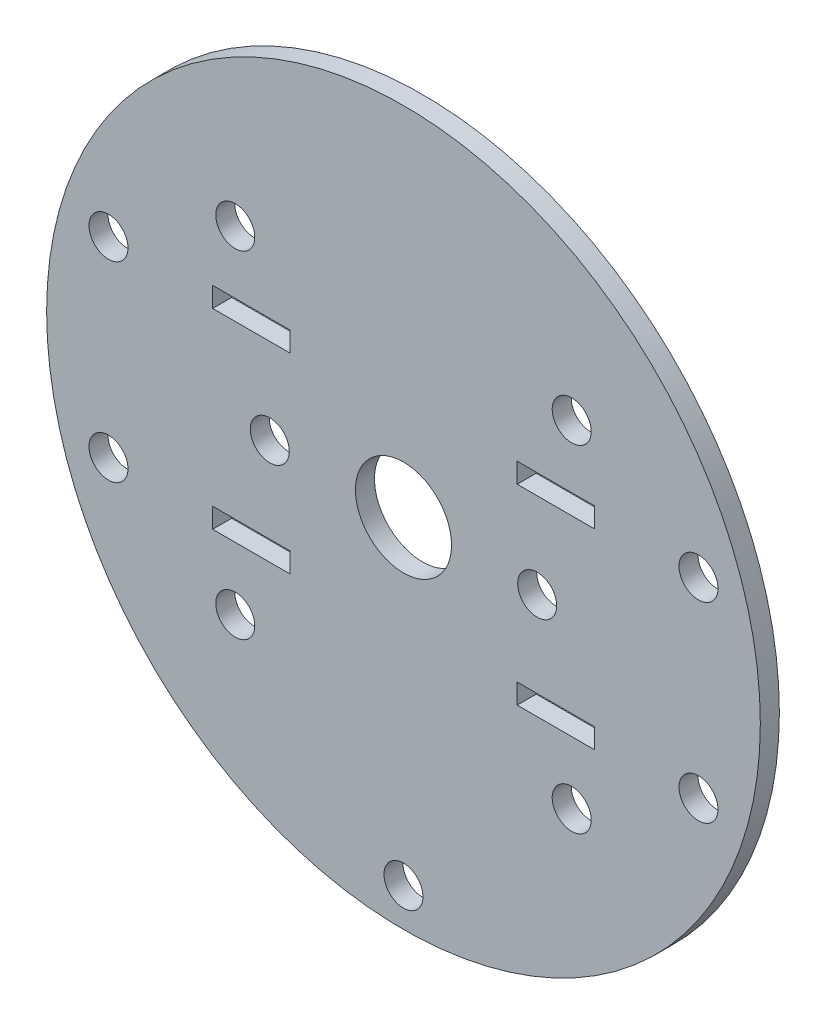
ISO-10303-21;
HEADER;
FILE_DESCRIPTION(('STEP AP214'),'2;1');
FILE_NAME('part.step','',(''),(''),'','','');
FILE_SCHEMA(('AUTOMOTIVE_DESIGN { 1 0 10303 214 1 1 1 1 }'));
ENDSEC;
DATA;
#1=APPLICATION_CONTEXT('core data for automotive mechanical design processes');
#2=APPLICATION_PROTOCOL_DEFINITION('international standard','automotive_design',2000,#1);
#3=PRODUCT_CONTEXT('',#1,'mechanical');
#4=PRODUCT('Part','Part','',(#3));
#5=PRODUCT_RELATED_PRODUCT_CATEGORY('part','',(#4));
#6=PRODUCT_DEFINITION_FORMATION('','',#4);
#7=PRODUCT_DEFINITION_CONTEXT('part definition',#1,'design');
#8=PRODUCT_DEFINITION('design','',#6,#7);
#9=PRODUCT_DEFINITION_SHAPE('','',#8);
#10=(LENGTH_UNIT() NAMED_UNIT(*) SI_UNIT(.MILLI.,.METRE.));
#11=(NAMED_UNIT(*) PLANE_ANGLE_UNIT() SI_UNIT($,.RADIAN.));
#12=(NAMED_UNIT(*) SI_UNIT($,.STERADIAN.) SOLID_ANGLE_UNIT());
#13=UNCERTAINTY_MEASURE_WITH_UNIT(LENGTH_MEASURE(1.E-05),#10,'distance_accuracy_value','');
#14=(GEOMETRIC_REPRESENTATION_CONTEXT(3) GLOBAL_UNCERTAINTY_ASSIGNED_CONTEXT((#13)) GLOBAL_UNIT_ASSIGNED_CONTEXT((#10,
#11,#12)) REPRESENTATION_CONTEXT('',''));
#15=CARTESIAN_POINT('',(0.,0.,0.));
#16=DIRECTION('',(0.,0.,1.));
#17=DIRECTION('',(1.,0.,0.));
#18=AXIS2_PLACEMENT_3D('',#15,#16,#17);
#19=CARTESIAN_POINT('',(0.,0.,2.));
#20=DIRECTION('',(0.,0.,1.));
#21=DIRECTION('',(1.,0.,0.));
#22=AXIS2_PLACEMENT_3D('',#19,#20,#21);
#23=PLANE('',#22);
#24=CARTESIAN_POINT('',(-14.05,0.,2.));
#25=DIRECTION('',(0.,0.,1.));
#26=DIRECTION('',(1.,0.,0.));
#27=AXIS2_PLACEMENT_3D('',#24,#25,#26);
#28=CIRCLE('',#27,2.05);
#29=CARTESIAN_POINT('',(-12.,0.,2.));
#30=VERTEX_POINT('',#29);
#31=EDGE_CURVE('E336',#30,#30,#28,.T.);
#32=ORIENTED_EDGE('',*,*,#31,.F.);
#33=EDGE_LOOP('',(#32));
#34=FACE_BOUND('',#33,.T.);
#35=CARTESIAN_POINT('',(31.,-10.05,2.));
#36=DIRECTION('',(0.,0.,1.));
#37=DIRECTION('',(-1.,0.,0.));
#38=AXIS2_PLACEMENT_3D('',#35,#36,#37);
#39=CIRCLE('',#38,2.05);
#40=CARTESIAN_POINT('',(28.95,-10.05,2.));
#41=VERTEX_POINT('',#40);
#42=EDGE_CURVE('E340',#41,#41,#39,.T.);
#43=ORIENTED_EDGE('',*,*,#42,.F.);
#44=EDGE_LOOP('',(#43));
#45=FACE_BOUND('',#44,.T.);
#46=CARTESIAN_POINT('',(-31.,10.05,2.));
#47=DIRECTION('',(0.,0.,1.));
#48=DIRECTION('',(-1.,0.,0.));
#49=AXIS2_PLACEMENT_3D('',#46,#47,#48);
#50=CIRCLE('',#49,2.05);
#51=CARTESIAN_POINT('',(-33.05,10.05,2.));
#52=VERTEX_POINT('',#51);
#53=EDGE_CURVE('E343',#52,#52,#50,.T.);
#54=ORIENTED_EDGE('',*,*,#53,.F.);
#55=EDGE_LOOP('',(#54));
#56=FACE_BOUND('',#55,.T.);
#57=DIRECTION('',(0.,1.,0.));
#58=VECTOR('',#57,1.);
#59=CARTESIAN_POINT('',(-11.95,-11.1,2.));
#60=LINE('',#59,#58);
#61=CARTESIAN_POINT('',(-11.95,-11.1,2.));
#62=VERTEX_POINT('',#61);
#63=CARTESIAN_POINT('',(-11.95,-8.99999999999999,2.));
#64=VERTEX_POINT('',#63);
#65=EDGE_CURVE('E156',#62,#64,#60,.T.);
#66=ORIENTED_EDGE('',*,*,#65,.F.);
#67=DIRECTION('',(1.,0.,0.));
#68=VECTOR('',#67,1.);
#69=CARTESIAN_POINT('',(-11.95,-11.1,2.));
#70=LINE('',#69,#68);
#71=CARTESIAN_POINT('',(-20.05,-11.1,2.));
#72=VERTEX_POINT('',#71);
#73=EDGE_CURVE('E148',#72,#62,#70,.T.);
#74=ORIENTED_EDGE('',*,*,#73,.F.);
#75=DIRECTION('',(0.,-1.,0.));
#76=VECTOR('',#75,1.);
#77=CARTESIAN_POINT('',(-20.05,-11.1,2.));
#78=LINE('',#77,#76);
#79=CARTESIAN_POINT('',(-20.05,-8.99999999999999,2.));
#80=VERTEX_POINT('',#79);
#81=EDGE_CURVE('E171',#80,#72,#78,.T.);
#82=ORIENTED_EDGE('',*,*,#81,.F.);
#83=DIRECTION('',(-1.,0.,0.));
#84=VECTOR('',#83,1.);
#85=CARTESIAN_POINT('',(-11.95,-8.99999999999999,2.));
#86=LINE('',#85,#84);
#87=EDGE_CURVE('E169',#64,#80,#86,.T.);
#88=ORIENTED_EDGE('',*,*,#87,.F.);
#89=EDGE_LOOP('',(#66,#74,#82,#88));
#90=FACE_BOUND('',#89,.T.);
#91=DIRECTION('',(0.,-1.,0.));
#92=VECTOR('',#91,1.);
#93=CARTESIAN_POINT('',(-20.05,11.1,2.));
#94=LINE('',#93,#92);
#95=CARTESIAN_POINT('',(-20.05,11.1,2.));
#96=VERTEX_POINT('',#95);
#97=CARTESIAN_POINT('',(-20.05,8.99999999999999,2.));
#98=VERTEX_POINT('',#97);
#99=EDGE_CURVE('E189',#96,#98,#94,.T.);
#100=ORIENTED_EDGE('',*,*,#99,.F.);
#101=DIRECTION('',(-1.,0.,0.));
#102=VECTOR('',#101,1.);
#103=CARTESIAN_POINT('',(-11.95,11.1,2.));
#104=LINE('',#103,#102);
#105=CARTESIAN_POINT('',(-11.95,11.1,2.));
#106=VERTEX_POINT('',#105);
#107=EDGE_CURVE('E187',#106,#96,#104,.T.);
#108=ORIENTED_EDGE('',*,*,#107,.F.);
#109=DIRECTION('',(0.,1.,0.));
#110=VECTOR('',#109,1.);
#111=CARTESIAN_POINT('',(-11.95,11.1,2.));
#112=LINE('',#111,#110);
#113=CARTESIAN_POINT('',(-11.95,8.99999999999999,2.));
#114=VERTEX_POINT('',#113);
#115=EDGE_CURVE('E195',#114,#106,#112,.T.);
#116=ORIENTED_EDGE('',*,*,#115,.F.);
#117=DIRECTION('',(1.,0.,0.));
#118=VECTOR('',#117,1.);
#119=CARTESIAN_POINT('',(-11.95,8.99999999999999,2.));
#120=LINE('',#119,#118);
#121=EDGE_CURVE('E192',#98,#114,#120,.T.);
#122=ORIENTED_EDGE('',*,*,#121,.F.);
#123=EDGE_LOOP('',(#100,#108,#116,#122));
#124=FACE_BOUND('',#123,.T.);
#125=CARTESIAN_POINT('',(17.6776695296637,-17.6776695296637,2.));
#126=DIRECTION('',(0.,0.,1.));
#127=DIRECTION('',(1.,0.,0.));
#128=AXIS2_PLACEMENT_3D('',#125,#126,#127);
#129=CIRCLE('',#128,2.05);
#130=CARTESIAN_POINT('',(19.7276695296637,-17.6776695296637,2.));
#131=VERTEX_POINT('',#130);
#132=EDGE_CURVE('E218',#131,#131,#129,.T.);
#133=ORIENTED_EDGE('',*,*,#132,.F.);
#134=EDGE_LOOP('',(#133));
#135=FACE_BOUND('',#134,.T.);
#136=CARTESIAN_POINT('',(-17.6776695296637,17.6776695296637,2.));
#137=DIRECTION('',(0.,0.,1.));
#138=DIRECTION('',(1.,0.,0.));
#139=AXIS2_PLACEMENT_3D('',#136,#137,#138);
#140=CIRCLE('',#139,2.05);
#141=CARTESIAN_POINT('',(-15.6276695296637,17.6776695296637,2.));
#142=VERTEX_POINT('',#141);
#143=EDGE_CURVE('E230',#142,#142,#140,.T.);
#144=ORIENTED_EDGE('',*,*,#143,.F.);
#145=EDGE_LOOP('',(#144));
#146=FACE_BOUND('',#145,.T.);
#147=CARTESIAN_POINT('',(0.,0.,2.));
#148=DIRECTION('',(0.,0.,1.));
#149=DIRECTION('',(1.,0.,0.));
#150=AXIS2_PLACEMENT_3D('',#147,#148,#149);
#151=CIRCLE('',#150,5.05);
#152=CARTESIAN_POINT('',(5.05,0.,2.));
#153=VERTEX_POINT('',#152);
#154=EDGE_CURVE('E304',#153,#153,#151,.T.);
#155=ORIENTED_EDGE('',*,*,#154,.F.);
#156=EDGE_LOOP('',(#155));
#157=FACE_BOUND('',#156,.T.);
#158=CARTESIAN_POINT('',(0.,0.,2.));
#159=DIRECTION('',(0.,0.,1.));
#160=DIRECTION('',(1.,0.,0.));
#161=AXIS2_PLACEMENT_3D('',#158,#159,#160);
#162=CIRCLE('',#161,37.5);
#163=CARTESIAN_POINT('',(37.5,0.,2.));
#164=VERTEX_POINT('',#163);
#165=EDGE_CURVE('E11',#164,#164,#162,.T.);
#166=ORIENTED_EDGE('',*,*,#165,.T.);
#167=EDGE_LOOP('',(#166));
#168=FACE_BOUND('',#167,.T.);
#169=CARTESIAN_POINT('',(-17.6776695296637,-17.6776695296637,2.));
#170=DIRECTION('',(0.,0.,1.));
#171=DIRECTION('',(1.,0.,0.));
#172=AXIS2_PLACEMENT_3D('',#169,#170,#171);
#173=CIRCLE('',#172,2.05);
#174=CARTESIAN_POINT('',(-15.6276695296637,-17.6776695296637,2.));
#175=VERTEX_POINT('',#174);
#176=EDGE_CURVE('E298',#175,#175,#173,.T.);
#177=ORIENTED_EDGE('',*,*,#176,.F.);
#178=EDGE_LOOP('',(#177));
#179=FACE_BOUND('',#178,.T.);
#180=DIRECTION('',(0.,1.,0.));
#181=VECTOR('',#180,1.);
#182=CARTESIAN_POINT('',(20.05,-11.1,2.));
#183=LINE('',#182,#181);
#184=CARTESIAN_POINT('',(20.05,-11.1,2.));
#185=VERTEX_POINT('',#184);
#186=CARTESIAN_POINT('',(20.05,-9.,2.));
#187=VERTEX_POINT('',#186);
#188=EDGE_CURVE('E269',#185,#187,#183,.T.);
#189=ORIENTED_EDGE('',*,*,#188,.F.);
#190=DIRECTION('',(1.,0.,0.));
#191=VECTOR('',#190,1.);
#192=CARTESIAN_POINT('',(11.95,-11.1,2.));
#193=LINE('',#192,#191);
#194=CARTESIAN_POINT('',(11.95,-11.1,2.));
#195=VERTEX_POINT('',#194);
#196=EDGE_CURVE('E267',#195,#185,#193,.T.);
#197=ORIENTED_EDGE('',*,*,#196,.F.);
#198=DIRECTION('',(0.,-1.,0.));
#199=VECTOR('',#198,1.);
#200=CARTESIAN_POINT('',(11.95,-11.1,2.));
#201=LINE('',#200,#199);
#202=CARTESIAN_POINT('',(11.95,-9.,2.));
#203=VERTEX_POINT('',#202);
#204=EDGE_CURVE('E275',#203,#195,#201,.T.);
#205=ORIENTED_EDGE('',*,*,#204,.F.);
#206=DIRECTION('',(-1.,0.,0.));
#207=VECTOR('',#206,1.);
#208=CARTESIAN_POINT('',(11.95,-9.,2.));
#209=LINE('',#208,#207);
#210=EDGE_CURVE('E272',#187,#203,#209,.T.);
#211=ORIENTED_EDGE('',*,*,#210,.F.);
#212=EDGE_LOOP('',(#189,#197,#205,#211));
#213=FACE_BOUND('',#212,.T.);
#214=DIRECTION('',(0.,-1.,0.));
#215=VECTOR('',#214,1.);
#216=CARTESIAN_POINT('',(11.95,11.1,2.));
#217=LINE('',#216,#215);
#218=CARTESIAN_POINT('',(11.95,11.1,2.));
#219=VERTEX_POINT('',#218);
#220=CARTESIAN_POINT('',(11.95,9.,2.));
#221=VERTEX_POINT('',#220);
#222=EDGE_CURVE('E238',#219,#221,#217,.T.);
#223=ORIENTED_EDGE('',*,*,#222,.F.);
#224=DIRECTION('',(-1.,0.,0.));
#225=VECTOR('',#224,1.);
#226=CARTESIAN_POINT('',(11.95,11.1,2.));
#227=LINE('',#226,#225);
#228=CARTESIAN_POINT('',(20.05,11.1,2.));
#229=VERTEX_POINT('',#228);
#230=EDGE_CURVE('E236',#229,#219,#227,.T.);
#231=ORIENTED_EDGE('',*,*,#230,.F.);
#232=DIRECTION('',(0.,1.,0.));
#233=VECTOR('',#232,1.);
#234=CARTESIAN_POINT('',(20.05,11.1,2.));
#235=LINE('',#234,#233);
#236=CARTESIAN_POINT('',(20.05,9.,2.));
#237=VERTEX_POINT('',#236);
#238=EDGE_CURVE('E244',#237,#229,#235,.T.);
#239=ORIENTED_EDGE('',*,*,#238,.F.);
#240=DIRECTION('',(1.,0.,0.));
#241=VECTOR('',#240,1.);
#242=CARTESIAN_POINT('',(11.95,9.,2.));
#243=LINE('',#242,#241);
#244=EDGE_CURVE('E241',#221,#237,#243,.T.);
#245=ORIENTED_EDGE('',*,*,#244,.F.);
#246=EDGE_LOOP('',(#223,#231,#239,#245));
#247=FACE_BOUND('',#246,.T.);
#248=CARTESIAN_POINT('',(17.6776695296637,17.6776695296637,2.));
#249=DIRECTION('',(0.,0.,1.));
#250=DIRECTION('',(1.,0.,0.));
#251=AXIS2_PLACEMENT_3D('',#248,#249,#250);
#252=CIRCLE('',#251,2.05);
#253=CARTESIAN_POINT('',(19.7276695296637,17.6776695296637,2.));
#254=VERTEX_POINT('',#253);
#255=EDGE_CURVE('E224',#254,#254,#252,.T.);
#256=ORIENTED_EDGE('',*,*,#255,.F.);
#257=EDGE_LOOP('',(#256));
#258=FACE_BOUND('',#257,.T.);
#259=CARTESIAN_POINT('',(-31.,-10.05,2.));
#260=DIRECTION('',(0.,0.,1.));
#261=DIRECTION('',(1.,0.,0.));
#262=AXIS2_PLACEMENT_3D('',#259,#260,#261);
#263=CIRCLE('',#262,2.05);
#264=CARTESIAN_POINT('',(-28.95,-10.05,2.));
#265=VERTEX_POINT('',#264);
#266=EDGE_CURVE('E177',#265,#265,#263,.T.);
#267=ORIENTED_EDGE('',*,*,#266,.F.);
#268=EDGE_LOOP('',(#267));
#269=FACE_BOUND('',#268,.T.);
#270=CARTESIAN_POINT('',(31.,10.05,2.));
#271=DIRECTION('',(0.,0.,1.));
#272=DIRECTION('',(1.,0.,0.));
#273=AXIS2_PLACEMENT_3D('',#270,#271,#272);
#274=CIRCLE('',#273,2.05);
#275=CARTESIAN_POINT('',(33.05,10.05,2.));
#276=VERTEX_POINT('',#275);
#277=EDGE_CURVE('E350',#276,#276,#274,.T.);
#278=ORIENTED_EDGE('',*,*,#277,.F.);
#279=EDGE_LOOP('',(#278));
#280=FACE_BOUND('',#279,.T.);
#281=CARTESIAN_POINT('',(14.05,0.,2.));
#282=DIRECTION('',(0.,0.,1.));
#283=DIRECTION('',(1.,0.,0.));
#284=AXIS2_PLACEMENT_3D('',#281,#282,#283);
#285=CIRCLE('',#284,2.05);
#286=CARTESIAN_POINT('',(16.1,0.,2.));
#287=VERTEX_POINT('',#286);
#288=EDGE_CURVE('E369',#287,#287,#285,.T.);
#289=ORIENTED_EDGE('',*,*,#288,.F.);
#290=EDGE_LOOP('',(#289));
#291=FACE_BOUND('',#290,.T.);
#292=CARTESIAN_POINT('',(0.,-33.5,2.));
#293=DIRECTION('',(0.,0.,1.));
#294=DIRECTION('',(1.,0.,0.));
#295=AXIS2_PLACEMENT_3D('',#292,#293,#294);
#296=CIRCLE('',#295,2.05);
#297=CARTESIAN_POINT('',(2.05000000000001,-33.5,2.));
#298=VERTEX_POINT('',#297);
#299=EDGE_CURVE('E372',#298,#298,#296,.T.);
#300=ORIENTED_EDGE('',*,*,#299,.F.);
#301=EDGE_LOOP('',(#300));
#302=FACE_BOUND('',#301,.T.);
#303=ADVANCED_FACE('F35',(#34,#45,#56,#90,#124,#135,#146,#157,#168,#179,#213,#247,#258,#269,
#280,#291,#302),#23,.T.);
#304=CARTESIAN_POINT('',(0.,0.,0.));
#305=DIRECTION('',(0.,0.,1.));
#306=DIRECTION('',(1.,0.,0.));
#307=AXIS2_PLACEMENT_3D('',#304,#305,#306);
#308=PLANE('',#307);
#309=DIRECTION('',(-1.,0.,0.));
#310=VECTOR('',#309,1.);
#311=CARTESIAN_POINT('',(-11.95,11.1,0.));
#312=LINE('',#311,#310);
#313=CARTESIAN_POINT('',(-11.95,11.1,0.));
#314=VERTEX_POINT('',#313);
#315=CARTESIAN_POINT('',(-20.05,11.1,0.));
#316=VERTEX_POINT('',#315);
#317=EDGE_CURVE('E164',#314,#316,#312,.T.);
#318=ORIENTED_EDGE('',*,*,#317,.T.);
#319=DIRECTION('',(0.,-1.,0.));
#320=VECTOR('',#319,1.);
#321=CARTESIAN_POINT('',(-20.05,11.1,0.));
#322=LINE('',#321,#320);
#323=CARTESIAN_POINT('',(-20.05,8.99999999999999,0.));
#324=VERTEX_POINT('',#323);
#325=EDGE_CURVE('E200',#316,#324,#322,.T.);
#326=ORIENTED_EDGE('',*,*,#325,.T.);
#327=DIRECTION('',(1.,0.,0.));
#328=VECTOR('',#327,1.);
#329=CARTESIAN_POINT('',(-11.95,8.99999999999999,0.));
#330=LINE('',#329,#328);
#331=CARTESIAN_POINT('',(-11.95,8.99999999999999,0.));
#332=VERTEX_POINT('',#331);
#333=EDGE_CURVE('E203',#324,#332,#330,.T.);
#334=ORIENTED_EDGE('',*,*,#333,.T.);
#335=DIRECTION('',(0.,1.,0.));
#336=VECTOR('',#335,1.);
#337=CARTESIAN_POINT('',(-11.95,11.1,0.));
#338=LINE('',#337,#336);
#339=EDGE_CURVE('E190',#332,#314,#338,.T.);
#340=ORIENTED_EDGE('',*,*,#339,.T.);
#341=EDGE_LOOP('',(#318,#326,#334,#340));
#342=FACE_BOUND('',#341,.T.);
#343=DIRECTION('',(1.,0.,0.));
#344=VECTOR('',#343,1.);
#345=CARTESIAN_POINT('',(11.95,-11.1,0.));
#346=LINE('',#345,#344);
#347=CARTESIAN_POINT('',(11.95,-11.1,0.));
#348=VERTEX_POINT('',#347);
#349=CARTESIAN_POINT('',(20.05,-11.1,0.));
#350=VERTEX_POINT('',#349);
#351=EDGE_CURVE('E266',#348,#350,#346,.T.);
#352=ORIENTED_EDGE('',*,*,#351,.T.);
#353=DIRECTION('',(0.,1.,0.));
#354=VECTOR('',#353,1.);
#355=CARTESIAN_POINT('',(20.05,-11.1,0.));
#356=LINE('',#355,#354);
#357=CARTESIAN_POINT('',(20.05,-9.,0.));
#358=VERTEX_POINT('',#357);
#359=EDGE_CURVE('E280',#350,#358,#356,.T.);
#360=ORIENTED_EDGE('',*,*,#359,.T.);
#361=DIRECTION('',(-1.,0.,0.));
#362=VECTOR('',#361,1.);
#363=CARTESIAN_POINT('',(11.95,-9.,0.));
#364=LINE('',#363,#362);
#365=CARTESIAN_POINT('',(11.95,-9.,0.));
#366=VERTEX_POINT('',#365);
#367=EDGE_CURVE('E283',#358,#366,#364,.T.);
#368=ORIENTED_EDGE('',*,*,#367,.T.);
#369=DIRECTION('',(0.,-1.,0.));
#370=VECTOR('',#369,1.);
#371=CARTESIAN_POINT('',(11.95,-11.1,0.));
#372=LINE('',#371,#370);
#373=EDGE_CURVE('E270',#366,#348,#372,.T.);
#374=ORIENTED_EDGE('',*,*,#373,.T.);
#375=EDGE_LOOP('',(#352,#360,#368,#374));
#376=FACE_BOUND('',#375,.T.);
#377=CARTESIAN_POINT('',(0.,0.,0.));
#378=DIRECTION('',(0.,0.,1.));
#379=DIRECTION('',(1.,0.,0.));
#380=AXIS2_PLACEMENT_3D('',#377,#378,#379);
#381=CIRCLE('',#380,37.5);
#382=CARTESIAN_POINT('',(37.5,0.,0.));
#383=VERTEX_POINT('',#382);
#384=EDGE_CURVE('E39',#383,#383,#381,.T.);
#385=ORIENTED_EDGE('',*,*,#384,.F.);
#386=EDGE_LOOP('',(#385));
#387=FACE_BOUND('',#386,.T.);
#388=CARTESIAN_POINT('',(0.,0.,0.));
#389=DIRECTION('',(0.,0.,1.));
#390=DIRECTION('',(1.,0.,0.));
#391=AXIS2_PLACEMENT_3D('',#388,#389,#390);
#392=CIRCLE('',#391,5.05);
#393=CARTESIAN_POINT('',(5.05,0.,0.));
#394=VERTEX_POINT('',#393);
#395=EDGE_CURVE('E301',#394,#394,#392,.T.);
#396=ORIENTED_EDGE('',*,*,#395,.T.);
#397=EDGE_LOOP('',(#396));
#398=FACE_BOUND('',#397,.T.);
#399=CARTESIAN_POINT('',(-17.6776695296637,-17.6776695296637,0.));
#400=DIRECTION('',(0.,0.,1.));
#401=DIRECTION('',(1.,0.,0.));
#402=AXIS2_PLACEMENT_3D('',#399,#400,#401);
#403=CIRCLE('',#402,2.05);
#404=CARTESIAN_POINT('',(-15.6276695296637,-17.6776695296637,0.));
#405=VERTEX_POINT('',#404);
#406=EDGE_CURVE('E297',#405,#405,#403,.T.);
#407=ORIENTED_EDGE('',*,*,#406,.T.);
#408=EDGE_LOOP('',(#407));
#409=FACE_BOUND('',#408,.T.);
#410=DIRECTION('',(-1.,0.,0.));
#411=VECTOR('',#410,1.);
#412=CARTESIAN_POINT('',(11.95,11.1,0.));
#413=LINE('',#412,#411);
#414=CARTESIAN_POINT('',(20.05,11.1,0.));
#415=VERTEX_POINT('',#414);
#416=CARTESIAN_POINT('',(11.95,11.1,0.));
#417=VERTEX_POINT('',#416);
#418=EDGE_CURVE('E233',#415,#417,#413,.T.);
#419=ORIENTED_EDGE('',*,*,#418,.T.);
#420=DIRECTION('',(0.,-1.,0.));
#421=VECTOR('',#420,1.);
#422=CARTESIAN_POINT('',(11.95,11.1,0.));
#423=LINE('',#422,#421);
#424=CARTESIAN_POINT('',(11.95,9.,0.));
#425=VERTEX_POINT('',#424);
#426=EDGE_CURVE('E249',#417,#425,#423,.T.);
#427=ORIENTED_EDGE('',*,*,#426,.T.);
#428=DIRECTION('',(1.,0.,0.));
#429=VECTOR('',#428,1.);
#430=CARTESIAN_POINT('',(11.95,9.,0.));
#431=LINE('',#430,#429);
#432=CARTESIAN_POINT('',(20.05,9.,0.));
#433=VERTEX_POINT('',#432);
#434=EDGE_CURVE('E252',#425,#433,#431,.T.);
#435=ORIENTED_EDGE('',*,*,#434,.T.);
#436=DIRECTION('',(0.,1.,0.));
#437=VECTOR('',#436,1.);
#438=CARTESIAN_POINT('',(20.05,11.1,0.));
#439=LINE('',#438,#437);
#440=EDGE_CURVE('E239',#433,#415,#439,.T.);
#441=ORIENTED_EDGE('',*,*,#440,.T.);
#442=EDGE_LOOP('',(#419,#427,#435,#441));
#443=FACE_BOUND('',#442,.T.);
#444=CARTESIAN_POINT('',(-17.6776695296637,17.6776695296637,0.));
#445=DIRECTION('',(0.,0.,1.));
#446=DIRECTION('',(1.,0.,0.));
#447=AXIS2_PLACEMENT_3D('',#444,#445,#446);
#448=CIRCLE('',#447,2.05);
#449=CARTESIAN_POINT('',(-15.6276695296637,17.6776695296637,0.));
#450=VERTEX_POINT('',#449);
#451=EDGE_CURVE('E227',#450,#450,#448,.T.);
#452=ORIENTED_EDGE('',*,*,#451,.T.);
#453=EDGE_LOOP('',(#452));
#454=FACE_BOUND('',#453,.T.);
#455=CARTESIAN_POINT('',(17.6776695296637,17.6776695296637,0.));
#456=DIRECTION('',(0.,0.,1.));
#457=DIRECTION('',(1.,0.,0.));
#458=AXIS2_PLACEMENT_3D('',#455,#456,#457);
#459=CIRCLE('',#458,2.05);
#460=CARTESIAN_POINT('',(19.7276695296637,17.6776695296637,0.));
#461=VERTEX_POINT('',#460);
#462=EDGE_CURVE('E221',#461,#461,#459,.T.);
#463=ORIENTED_EDGE('',*,*,#462,.T.);
#464=EDGE_LOOP('',(#463));
#465=FACE_BOUND('',#464,.T.);
#466=CARTESIAN_POINT('',(17.6776695296637,-17.6776695296637,0.));
#467=DIRECTION('',(0.,0.,1.));
#468=DIRECTION('',(1.,0.,0.));
#469=AXIS2_PLACEMENT_3D('',#466,#467,#468);
#470=CIRCLE('',#469,2.05);
#471=CARTESIAN_POINT('',(19.7276695296637,-17.6776695296637,0.));
#472=VERTEX_POINT('',#471);
#473=EDGE_CURVE('E217',#472,#472,#470,.T.);
#474=ORIENTED_EDGE('',*,*,#473,.T.);
#475=EDGE_LOOP('',(#474));
#476=FACE_BOUND('',#475,.T.);
#477=DIRECTION('',(1.,0.,0.));
#478=VECTOR('',#477,1.);
#479=CARTESIAN_POINT('',(-11.95,-11.1,0.));
#480=LINE('',#479,#478);
#481=CARTESIAN_POINT('',(-20.05,-11.1,0.));
#482=VERTEX_POINT('',#481);
#483=CARTESIAN_POINT('',(-11.95,-11.1,0.));
#484=VERTEX_POINT('',#483);
#485=EDGE_CURVE('E58',#482,#484,#480,.T.);
#486=ORIENTED_EDGE('',*,*,#485,.T.);
#487=DIRECTION('',(0.,1.,0.));
#488=VECTOR('',#487,1.);
#489=CARTESIAN_POINT('',(-11.95,-11.1,0.));
#490=LINE('',#489,#488);
#491=CARTESIAN_POINT('',(-11.95,-8.99999999999999,0.));
#492=VERTEX_POINT('',#491);
#493=EDGE_CURVE('E163',#484,#492,#490,.T.);
#494=ORIENTED_EDGE('',*,*,#493,.T.);
#495=DIRECTION('',(-1.,0.,0.));
#496=VECTOR('',#495,1.);
#497=CARTESIAN_POINT('',(-11.95,-8.99999999999999,0.));
#498=LINE('',#497,#496);
#499=CARTESIAN_POINT('',(-20.05,-8.99999999999999,0.));
#500=VERTEX_POINT('',#499);
#501=EDGE_CURVE('E179',#492,#500,#498,.T.);
#502=ORIENTED_EDGE('',*,*,#501,.T.);
#503=DIRECTION('',(0.,-1.,0.));
#504=VECTOR('',#503,1.);
#505=CARTESIAN_POINT('',(-20.05,-11.1,0.));
#506=LINE('',#505,#504);
#507=EDGE_CURVE('E157',#500,#482,#506,.T.);
#508=ORIENTED_EDGE('',*,*,#507,.T.);
#509=EDGE_LOOP('',(#486,#494,#502,#508));
#510=FACE_BOUND('',#509,.T.);
#511=CARTESIAN_POINT('',(-31.,-10.05,0.));
#512=DIRECTION('',(0.,0.,1.));
#513=DIRECTION('',(1.,0.,0.));
#514=AXIS2_PLACEMENT_3D('',#511,#512,#513);
#515=CIRCLE('',#514,2.05);
#516=CARTESIAN_POINT('',(-28.95,-10.05,0.));
#517=VERTEX_POINT('',#516);
#518=EDGE_CURVE('E345',#517,#517,#515,.T.);
#519=ORIENTED_EDGE('',*,*,#518,.T.);
#520=EDGE_LOOP('',(#519));
#521=FACE_BOUND('',#520,.T.);
#522=CARTESIAN_POINT('',(-31.,10.05,0.));
#523=DIRECTION('',(0.,0.,1.));
#524=DIRECTION('',(-1.,0.,0.));
#525=AXIS2_PLACEMENT_3D('',#522,#523,#524);
#526=CIRCLE('',#525,2.05);
#527=CARTESIAN_POINT('',(-33.05,10.05,0.));
#528=VERTEX_POINT('',#527);
#529=EDGE_CURVE('E346',#528,#528,#526,.T.);
#530=ORIENTED_EDGE('',*,*,#529,.T.);
#531=EDGE_LOOP('',(#530));
#532=FACE_BOUND('',#531,.T.);
#533=CARTESIAN_POINT('',(31.,10.05,0.));
#534=DIRECTION('',(0.,0.,1.));
#535=DIRECTION('',(1.,0.,0.));
#536=AXIS2_PLACEMENT_3D('',#533,#534,#535);
#537=CIRCLE('',#536,2.05);
#538=CARTESIAN_POINT('',(33.05,10.05,0.));
#539=VERTEX_POINT('',#538);
#540=EDGE_CURVE('E353',#539,#539,#537,.T.);
#541=ORIENTED_EDGE('',*,*,#540,.T.);
#542=EDGE_LOOP('',(#541));
#543=FACE_BOUND('',#542,.T.);
#544=CARTESIAN_POINT('',(31.,-10.05,0.));
#545=DIRECTION('',(0.,0.,1.));
#546=DIRECTION('',(-1.,0.,0.));
#547=AXIS2_PLACEMENT_3D('',#544,#545,#546);
#548=CIRCLE('',#547,2.05);
#549=CARTESIAN_POINT('',(28.95,-10.05,0.));
#550=VERTEX_POINT('',#549);
#551=EDGE_CURVE('E385',#550,#550,#548,.T.);
#552=ORIENTED_EDGE('',*,*,#551,.T.);
#553=EDGE_LOOP('',(#552));
#554=FACE_BOUND('',#553,.T.);
#555=CARTESIAN_POINT('',(14.05,0.,0.));
#556=DIRECTION('',(0.,0.,1.));
#557=DIRECTION('',(1.,0.,0.));
#558=AXIS2_PLACEMENT_3D('',#555,#556,#557);
#559=CIRCLE('',#558,2.05);
#560=CARTESIAN_POINT('',(16.1,0.,0.));
#561=VERTEX_POINT('',#560);
#562=EDGE_CURVE('E382',#561,#561,#559,.T.);
#563=ORIENTED_EDGE('',*,*,#562,.T.);
#564=EDGE_LOOP('',(#563));
#565=FACE_BOUND('',#564,.T.);
#566=CARTESIAN_POINT('',(-14.05,0.,0.));
#567=DIRECTION('',(0.,0.,1.));
#568=DIRECTION('',(1.,0.,0.));
#569=AXIS2_PLACEMENT_3D('',#566,#567,#568);
#570=CIRCLE('',#569,2.05);
#571=CARTESIAN_POINT('',(-12.,0.,0.));
#572=VERTEX_POINT('',#571);
#573=EDGE_CURVE('E374',#572,#572,#570,.T.);
#574=ORIENTED_EDGE('',*,*,#573,.T.);
#575=EDGE_LOOP('',(#574));
#576=FACE_BOUND('',#575,.T.);
#577=CARTESIAN_POINT('',(0.,-33.5,0.));
#578=DIRECTION('',(0.,0.,1.));
#579=DIRECTION('',(1.,0.,0.));
#580=AXIS2_PLACEMENT_3D('',#577,#578,#579);
#581=CIRCLE('',#580,2.05);
#582=CARTESIAN_POINT('',(2.05000000000001,-33.5,0.));
#583=VERTEX_POINT('',#582);
#584=EDGE_CURVE('E375',#583,#583,#581,.T.);
#585=ORIENTED_EDGE('',*,*,#584,.T.);
#586=EDGE_LOOP('',(#585));
#587=FACE_BOUND('',#586,.T.);
#588=ADVANCED_FACE('F310',(#342,#376,#387,#398,#409,#443,#454,#465,#476,#510,#521,#532,#543,
#554,#565,#576,#587),#308,.F.);
#589=CARTESIAN_POINT('',(0.,0.,2.));
#590=DIRECTION('',(0.,0.,-1.));
#591=DIRECTION('',(-1.,0.,0.));
#592=AXIS2_PLACEMENT_3D('',#589,#590,#591);
#593=CYLINDRICAL_SURFACE('',#592,37.5);
#594=ORIENTED_EDGE('',*,*,#165,.F.);
#595=EDGE_LOOP('',(#594));
#596=FACE_BOUND('',#595,.T.);
#597=ORIENTED_EDGE('',*,*,#384,.T.);
#598=EDGE_LOOP('',(#597));
#599=FACE_BOUND('',#598,.T.);
#600=ADVANCED_FACE('F37',(#596,#599),#593,.T.);
#601=CARTESIAN_POINT('',(0.,0.,2.));
#602=DIRECTION('',(0.,0.,-1.));
#603=DIRECTION('',(-1.,0.,0.));
#604=AXIS2_PLACEMENT_3D('',#601,#602,#603);
#605=CYLINDRICAL_SURFACE('',#604,5.05);
#606=ORIENTED_EDGE('',*,*,#154,.T.);
#607=EDGE_LOOP('',(#606));
#608=FACE_BOUND('',#607,.T.);
#609=ORIENTED_EDGE('',*,*,#395,.F.);
#610=EDGE_LOOP('',(#609));
#611=FACE_BOUND('',#610,.T.);
#612=ADVANCED_FACE('F313',(#608,#611),#605,.F.);
#613=CARTESIAN_POINT('',(-17.6776695296637,-17.6776695296637,2.));
#614=DIRECTION('',(0.,0.,-1.));
#615=DIRECTION('',(-1.,0.,0.));
#616=AXIS2_PLACEMENT_3D('',#613,#614,#615);
#617=CYLINDRICAL_SURFACE('',#616,2.05);
#618=ORIENTED_EDGE('',*,*,#176,.T.);
#619=EDGE_LOOP('',(#618));
#620=FACE_BOUND('',#619,.T.);
#621=ORIENTED_EDGE('',*,*,#406,.F.);
#622=EDGE_LOOP('',(#621));
#623=FACE_BOUND('',#622,.T.);
#624=ADVANCED_FACE('F315',(#620,#623),#617,.F.);
#625=CARTESIAN_POINT('',(11.95,-11.1,2.));
#626=DIRECTION('',(0.,1.,0.));
#627=DIRECTION('',(-1.,0.,0.));
#628=AXIS2_PLACEMENT_3D('',#625,#626,#627);
#629=PLANE('',#628);
#630=ORIENTED_EDGE('',*,*,#351,.F.);
#631=DIRECTION('',(0.,0.,-1.));
#632=VECTOR('',#631,1.);
#633=CARTESIAN_POINT('',(11.95,-11.1,2.));
#634=LINE('',#633,#632);
#635=EDGE_CURVE('E277',#195,#348,#634,.T.);
#636=ORIENTED_EDGE('',*,*,#635,.F.);
#637=ORIENTED_EDGE('',*,*,#196,.T.);
#638=DIRECTION('',(0.,0.,-1.));
#639=VECTOR('',#638,1.);
#640=CARTESIAN_POINT('',(20.05,-11.1,2.));
#641=LINE('',#640,#639);
#642=EDGE_CURVE('E294',#185,#350,#641,.T.);
#643=ORIENTED_EDGE('',*,*,#642,.T.);
#644=EDGE_LOOP('',(#630,#636,#637,#643));
#645=FACE_BOUND('',#644,.T.);
#646=ADVANCED_FACE('F322',(#645),#629,.T.);
#647=CARTESIAN_POINT('',(20.05,-11.1,2.));
#648=DIRECTION('',(-1.,0.,0.));
#649=DIRECTION('',(0.,0.,1.));
#650=AXIS2_PLACEMENT_3D('',#647,#648,#649);
#651=PLANE('',#650);
#652=ORIENTED_EDGE('',*,*,#359,.F.);
#653=ORIENTED_EDGE('',*,*,#642,.F.);
#654=ORIENTED_EDGE('',*,*,#188,.T.);
#655=DIRECTION('',(0.,0.,-1.));
#656=VECTOR('',#655,1.);
#657=CARTESIAN_POINT('',(20.05,-9.,2.));
#658=LINE('',#657,#656);
#659=EDGE_CURVE('E292',#187,#358,#658,.T.);
#660=ORIENTED_EDGE('',*,*,#659,.T.);
#661=EDGE_LOOP('',(#652,#653,#654,#660));
#662=FACE_BOUND('',#661,.T.);
#663=ADVANCED_FACE('F475',(#662),#651,.T.);
#664=CARTESIAN_POINT('',(11.95,-9.,2.));
#665=DIRECTION('',(0.,-1.,0.));
#666=DIRECTION('',(1.,0.,0.));
#667=AXIS2_PLACEMENT_3D('',#664,#665,#666);
#668=PLANE('',#667);
#669=ORIENTED_EDGE('',*,*,#367,.F.);
#670=ORIENTED_EDGE('',*,*,#659,.F.);
#671=ORIENTED_EDGE('',*,*,#210,.T.);
#672=DIRECTION('',(0.,0.,-1.));
#673=VECTOR('',#672,1.);
#674=CARTESIAN_POINT('',(11.95,-9.,2.));
#675=LINE('',#674,#673);
#676=EDGE_CURVE('E290',#203,#366,#675,.T.);
#677=ORIENTED_EDGE('',*,*,#676,.T.);
#678=EDGE_LOOP('',(#669,#670,#671,#677));
#679=FACE_BOUND('',#678,.T.);
#680=ADVANCED_FACE('F471',(#679),#668,.T.);
#681=CARTESIAN_POINT('',(11.95,-11.1,2.));
#682=DIRECTION('',(1.,0.,0.));
#683=DIRECTION('',(0.,0.,-1.));
#684=AXIS2_PLACEMENT_3D('',#681,#682,#683);
#685=PLANE('',#684);
#686=ORIENTED_EDGE('',*,*,#373,.F.);
#687=ORIENTED_EDGE('',*,*,#676,.F.);
#688=ORIENTED_EDGE('',*,*,#204,.T.);
#689=ORIENTED_EDGE('',*,*,#635,.T.);
#690=EDGE_LOOP('',(#686,#687,#688,#689));
#691=FACE_BOUND('',#690,.T.);
#692=ADVANCED_FACE('F467',(#691),#685,.T.);
#693=CARTESIAN_POINT('',(11.95,11.1,2.));
#694=DIRECTION('',(0.,-1.,0.));
#695=DIRECTION('',(1.,0.,0.));
#696=AXIS2_PLACEMENT_3D('',#693,#694,#695);
#697=PLANE('',#696);
#698=ORIENTED_EDGE('',*,*,#418,.F.);
#699=DIRECTION('',(0.,0.,-1.));
#700=VECTOR('',#699,1.);
#701=CARTESIAN_POINT('',(20.05,11.1,2.));
#702=LINE('',#701,#700);
#703=EDGE_CURVE('E246',#229,#415,#702,.T.);
#704=ORIENTED_EDGE('',*,*,#703,.F.);
#705=ORIENTED_EDGE('',*,*,#230,.T.);
#706=DIRECTION('',(0.,0.,-1.));
#707=VECTOR('',#706,1.);
#708=CARTESIAN_POINT('',(11.95,11.1,2.));
#709=LINE('',#708,#707);
#710=EDGE_CURVE('E263',#219,#417,#709,.T.);
#711=ORIENTED_EDGE('',*,*,#710,.T.);
#712=EDGE_LOOP('',(#698,#704,#705,#711));
#713=FACE_BOUND('',#712,.T.);
#714=ADVANCED_FACE('F463',(#713),#697,.T.);
#715=CARTESIAN_POINT('',(11.95,11.1,2.));
#716=DIRECTION('',(1.,0.,0.));
#717=DIRECTION('',(0.,0.,-1.));
#718=AXIS2_PLACEMENT_3D('',#715,#716,#717);
#719=PLANE('',#718);
#720=ORIENTED_EDGE('',*,*,#426,.F.);
#721=ORIENTED_EDGE('',*,*,#710,.F.);
#722=ORIENTED_EDGE('',*,*,#222,.T.);
#723=DIRECTION('',(0.,0.,-1.));
#724=VECTOR('',#723,1.);
#725=CARTESIAN_POINT('',(11.95,9.,2.));
#726=LINE('',#725,#724);
#727=EDGE_CURVE('E261',#221,#425,#726,.T.);
#728=ORIENTED_EDGE('',*,*,#727,.T.);
#729=EDGE_LOOP('',(#720,#721,#722,#728));
#730=FACE_BOUND('',#729,.T.);
#731=ADVANCED_FACE('F459',(#730),#719,.T.);
#732=CARTESIAN_POINT('',(11.95,9.,2.));
#733=DIRECTION('',(0.,1.,0.));
#734=DIRECTION('',(-1.,0.,0.));
#735=AXIS2_PLACEMENT_3D('',#732,#733,#734);
#736=PLANE('',#735);
#737=ORIENTED_EDGE('',*,*,#434,.F.);
#738=ORIENTED_EDGE('',*,*,#727,.F.);
#739=ORIENTED_EDGE('',*,*,#244,.T.);
#740=DIRECTION('',(0.,0.,-1.));
#741=VECTOR('',#740,1.);
#742=CARTESIAN_POINT('',(20.05,9.,2.));
#743=LINE('',#742,#741);
#744=EDGE_CURVE('E259',#237,#433,#743,.T.);
#745=ORIENTED_EDGE('',*,*,#744,.T.);
#746=EDGE_LOOP('',(#737,#738,#739,#745));
#747=FACE_BOUND('',#746,.T.);
#748=ADVANCED_FACE('F455',(#747),#736,.T.);
#749=CARTESIAN_POINT('',(20.05,11.1,2.));
#750=DIRECTION('',(-1.,0.,0.));
#751=DIRECTION('',(0.,0.,1.));
#752=AXIS2_PLACEMENT_3D('',#749,#750,#751);
#753=PLANE('',#752);
#754=ORIENTED_EDGE('',*,*,#440,.F.);
#755=ORIENTED_EDGE('',*,*,#744,.F.);
#756=ORIENTED_EDGE('',*,*,#238,.T.);
#757=ORIENTED_EDGE('',*,*,#703,.T.);
#758=EDGE_LOOP('',(#754,#755,#756,#757));
#759=FACE_BOUND('',#758,.T.);
#760=ADVANCED_FACE('F451',(#759),#753,.T.);
#761=CARTESIAN_POINT('',(-17.6776695296637,17.6776695296637,2.));
#762=DIRECTION('',(0.,0.,-1.));
#763=DIRECTION('',(-1.,0.,0.));
#764=AXIS2_PLACEMENT_3D('',#761,#762,#763);
#765=CYLINDRICAL_SURFACE('',#764,2.05);
#766=ORIENTED_EDGE('',*,*,#143,.T.);
#767=EDGE_LOOP('',(#766));
#768=FACE_BOUND('',#767,.T.);
#769=ORIENTED_EDGE('',*,*,#451,.F.);
#770=EDGE_LOOP('',(#769));
#771=FACE_BOUND('',#770,.T.);
#772=ADVANCED_FACE('F447',(#768,#771),#765,.F.);
#773=CARTESIAN_POINT('',(17.6776695296637,17.6776695296637,2.));
#774=DIRECTION('',(0.,0.,-1.));
#775=DIRECTION('',(-1.,0.,0.));
#776=AXIS2_PLACEMENT_3D('',#773,#774,#775);
#777=CYLINDRICAL_SURFACE('',#776,2.05);
#778=ORIENTED_EDGE('',*,*,#255,.T.);
#779=EDGE_LOOP('',(#778));
#780=FACE_BOUND('',#779,.T.);
#781=ORIENTED_EDGE('',*,*,#462,.F.);
#782=EDGE_LOOP('',(#781));
#783=FACE_BOUND('',#782,.T.);
#784=ADVANCED_FACE('F443',(#780,#783),#777,.F.);
#785=CARTESIAN_POINT('',(17.6776695296637,-17.6776695296637,2.));
#786=DIRECTION('',(0.,0.,-1.));
#787=DIRECTION('',(-1.,0.,0.));
#788=AXIS2_PLACEMENT_3D('',#785,#786,#787);
#789=CYLINDRICAL_SURFACE('',#788,2.05);
#790=ORIENTED_EDGE('',*,*,#132,.T.);
#791=EDGE_LOOP('',(#790));
#792=FACE_BOUND('',#791,.T.);
#793=ORIENTED_EDGE('',*,*,#473,.F.);
#794=EDGE_LOOP('',(#793));
#795=FACE_BOUND('',#794,.T.);
#796=ADVANCED_FACE('F439',(#792,#795),#789,.F.);
#797=CARTESIAN_POINT('',(-11.95,11.1,2.));
#798=DIRECTION('',(0.,-1.,0.));
#799=DIRECTION('',(0.,0.,-1.));
#800=AXIS2_PLACEMENT_3D('',#797,#798,#799);
#801=PLANE('',#800);
#802=ORIENTED_EDGE('',*,*,#317,.F.);
#803=DIRECTION('',(0.,0.,-1.));
#804=VECTOR('',#803,1.);
#805=CARTESIAN_POINT('',(-11.95,11.1,2.));
#806=LINE('',#805,#804);
#807=EDGE_CURVE('E197',#106,#314,#806,.T.);
#808=ORIENTED_EDGE('',*,*,#807,.F.);
#809=ORIENTED_EDGE('',*,*,#107,.T.);
#810=DIRECTION('',(0.,0.,-1.));
#811=VECTOR('',#810,1.);
#812=CARTESIAN_POINT('',(-20.05,11.1,2.));
#813=LINE('',#812,#811);
#814=EDGE_CURVE('E214',#96,#316,#813,.T.);
#815=ORIENTED_EDGE('',*,*,#814,.T.);
#816=EDGE_LOOP('',(#802,#808,#809,#815));
#817=FACE_BOUND('',#816,.T.);
#818=ADVANCED_FACE('F435',(#817),#801,.T.);
#819=CARTESIAN_POINT('',(-20.05,11.1,2.));
#820=DIRECTION('',(1.,0.,0.));
#821=DIRECTION('',(0.,0.,-1.));
#822=AXIS2_PLACEMENT_3D('',#819,#820,#821);
#823=PLANE('',#822);
#824=ORIENTED_EDGE('',*,*,#325,.F.);
#825=ORIENTED_EDGE('',*,*,#814,.F.);
#826=ORIENTED_EDGE('',*,*,#99,.T.);
#827=DIRECTION('',(0.,0.,-1.));
#828=VECTOR('',#827,1.);
#829=CARTESIAN_POINT('',(-20.05,8.99999999999999,2.));
#830=LINE('',#829,#828);
#831=EDGE_CURVE('E212',#98,#324,#830,.T.);
#832=ORIENTED_EDGE('',*,*,#831,.T.);
#833=EDGE_LOOP('',(#824,#825,#826,#832));
#834=FACE_BOUND('',#833,.T.);
#835=ADVANCED_FACE('F431',(#834),#823,.T.);
#836=CARTESIAN_POINT('',(-11.95,8.99999999999999,2.));
#837=DIRECTION('',(0.,1.,0.));
#838=DIRECTION('',(0.,0.,1.));
#839=AXIS2_PLACEMENT_3D('',#836,#837,#838);
#840=PLANE('',#839);
#841=ORIENTED_EDGE('',*,*,#333,.F.);
#842=ORIENTED_EDGE('',*,*,#831,.F.);
#843=ORIENTED_EDGE('',*,*,#121,.T.);
#844=DIRECTION('',(0.,0.,-1.));
#845=VECTOR('',#844,1.);
#846=CARTESIAN_POINT('',(-11.95,8.99999999999999,2.));
#847=LINE('',#846,#845);
#848=EDGE_CURVE('E210',#114,#332,#847,.T.);
#849=ORIENTED_EDGE('',*,*,#848,.T.);
#850=EDGE_LOOP('',(#841,#842,#843,#849));
#851=FACE_BOUND('',#850,.T.);
#852=ADVANCED_FACE('F427',(#851),#840,.T.);
#853=CARTESIAN_POINT('',(-11.95,11.1,2.));
#854=DIRECTION('',(-1.,0.,0.));
#855=DIRECTION('',(0.,0.,1.));
#856=AXIS2_PLACEMENT_3D('',#853,#854,#855);
#857=PLANE('',#856);
#858=ORIENTED_EDGE('',*,*,#339,.F.);
#859=ORIENTED_EDGE('',*,*,#848,.F.);
#860=ORIENTED_EDGE('',*,*,#115,.T.);
#861=ORIENTED_EDGE('',*,*,#807,.T.);
#862=EDGE_LOOP('',(#858,#859,#860,#861));
#863=FACE_BOUND('',#862,.T.);
#864=ADVANCED_FACE('F424',(#863),#857,.T.);
#865=CARTESIAN_POINT('',(-11.95,-11.1,2.));
#866=DIRECTION('',(0.,1.,0.));
#867=DIRECTION('',(0.,0.,1.));
#868=AXIS2_PLACEMENT_3D('',#865,#866,#867);
#869=PLANE('',#868);
#870=ORIENTED_EDGE('',*,*,#485,.F.);
#871=DIRECTION('',(0.,0.,-1.));
#872=VECTOR('',#871,1.);
#873=CARTESIAN_POINT('',(-20.05,-11.1,2.));
#874=LINE('',#873,#872);
#875=EDGE_CURVE('E152',#72,#482,#874,.T.);
#876=ORIENTED_EDGE('',*,*,#875,.F.);
#877=ORIENTED_EDGE('',*,*,#73,.T.);
#878=DIRECTION('',(0.,0.,-1.));
#879=VECTOR('',#878,1.);
#880=CARTESIAN_POINT('',(-11.95,-11.1,2.));
#881=LINE('',#880,#879);
#882=EDGE_CURVE('E151',#62,#484,#881,.T.);
#883=ORIENTED_EDGE('',*,*,#882,.T.);
#884=EDGE_LOOP('',(#870,#876,#877,#883));
#885=FACE_BOUND('',#884,.T.);
#886=ADVANCED_FACE('F150',(#885),#869,.T.);
#887=CARTESIAN_POINT('',(-11.95,-11.1,2.));
#888=DIRECTION('',(-1.,0.,0.));
#889=DIRECTION('',(0.,0.,1.));
#890=AXIS2_PLACEMENT_3D('',#887,#888,#889);
#891=PLANE('',#890);
#892=ORIENTED_EDGE('',*,*,#493,.F.);
#893=ORIENTED_EDGE('',*,*,#882,.F.);
#894=ORIENTED_EDGE('',*,*,#65,.T.);
#895=DIRECTION('',(0.,0.,-1.));
#896=VECTOR('',#895,1.);
#897=CARTESIAN_POINT('',(-11.95,-8.99999999999999,2.));
#898=LINE('',#897,#896);
#899=EDGE_CURVE('E165',#64,#492,#898,.T.);
#900=ORIENTED_EDGE('',*,*,#899,.T.);
#901=EDGE_LOOP('',(#892,#893,#894,#900));
#902=FACE_BOUND('',#901,.T.);
#903=ADVANCED_FACE('F160',(#902),#891,.T.);
#904=CARTESIAN_POINT('',(-11.95,-8.99999999999999,2.));
#905=DIRECTION('',(0.,-1.,0.));
#906=DIRECTION('',(0.,0.,-1.));
#907=AXIS2_PLACEMENT_3D('',#904,#905,#906);
#908=PLANE('',#907);
#909=ORIENTED_EDGE('',*,*,#501,.F.);
#910=ORIENTED_EDGE('',*,*,#899,.F.);
#911=ORIENTED_EDGE('',*,*,#87,.T.);
#912=DIRECTION('',(0.,0.,-1.));
#913=VECTOR('',#912,1.);
#914=CARTESIAN_POINT('',(-20.05,-8.99999999999999,2.));
#915=LINE('',#914,#913);
#916=EDGE_CURVE('E50',#80,#500,#915,.T.);
#917=ORIENTED_EDGE('',*,*,#916,.T.);
#918=EDGE_LOOP('',(#909,#910,#911,#917));
#919=FACE_BOUND('',#918,.T.);
#920=ADVANCED_FACE('F416',(#919),#908,.T.);
#921=CARTESIAN_POINT('',(-20.05,-11.1,2.));
#922=DIRECTION('',(1.,0.,0.));
#923=DIRECTION('',(0.,0.,-1.));
#924=AXIS2_PLACEMENT_3D('',#921,#922,#923);
#925=PLANE('',#924);
#926=ORIENTED_EDGE('',*,*,#507,.F.);
#927=ORIENTED_EDGE('',*,*,#916,.F.);
#928=ORIENTED_EDGE('',*,*,#81,.T.);
#929=ORIENTED_EDGE('',*,*,#875,.T.);
#930=EDGE_LOOP('',(#926,#927,#928,#929));
#931=FACE_BOUND('',#930,.T.);
#932=ADVANCED_FACE('F413',(#931),#925,.T.);
#933=CARTESIAN_POINT('',(-31.,-10.05,2.));
#934=DIRECTION('',(0.,0.,-1.));
#935=DIRECTION('',(-1.,0.,0.));
#936=AXIS2_PLACEMENT_3D('',#933,#934,#935);
#937=CYLINDRICAL_SURFACE('',#936,2.05);
#938=ORIENTED_EDGE('',*,*,#266,.T.);
#939=EDGE_LOOP('',(#938));
#940=FACE_BOUND('',#939,.T.);
#941=ORIENTED_EDGE('',*,*,#518,.F.);
#942=EDGE_LOOP('',(#941));
#943=FACE_BOUND('',#942,.T.);
#944=ADVANCED_FACE('F359',(#940,#943),#937,.F.);
#945=CARTESIAN_POINT('',(-31.,10.05,2.));
#946=DIRECTION('',(0.,0.,-1.));
#947=DIRECTION('',(-1.,0.,0.));
#948=AXIS2_PLACEMENT_3D('',#945,#946,#947);
#949=CYLINDRICAL_SURFACE('',#948,2.05);
#950=ORIENTED_EDGE('',*,*,#53,.T.);
#951=EDGE_LOOP('',(#950));
#952=FACE_BOUND('',#951,.T.);
#953=ORIENTED_EDGE('',*,*,#529,.F.);
#954=EDGE_LOOP('',(#953));
#955=FACE_BOUND('',#954,.T.);
#956=ADVANCED_FACE('F399',(#952,#955),#949,.F.);
#957=CARTESIAN_POINT('',(31.,10.05,2.));
#958=DIRECTION('',(0.,0.,-1.));
#959=DIRECTION('',(-1.,0.,0.));
#960=AXIS2_PLACEMENT_3D('',#957,#958,#959);
#961=CYLINDRICAL_SURFACE('',#960,2.05);
#962=ORIENTED_EDGE('',*,*,#277,.T.);
#963=EDGE_LOOP('',(#962));
#964=FACE_BOUND('',#963,.T.);
#965=ORIENTED_EDGE('',*,*,#540,.F.);
#966=EDGE_LOOP('',(#965));
#967=FACE_BOUND('',#966,.T.);
#968=ADVANCED_FACE('F396',(#964,#967),#961,.F.);
#969=CARTESIAN_POINT('',(31.,-10.05,2.));
#970=DIRECTION('',(0.,0.,-1.));
#971=DIRECTION('',(-1.,0.,0.));
#972=AXIS2_PLACEMENT_3D('',#969,#970,#971);
#973=CYLINDRICAL_SURFACE('',#972,2.05);
#974=ORIENTED_EDGE('',*,*,#42,.T.);
#975=EDGE_LOOP('',(#974));
#976=FACE_BOUND('',#975,.T.);
#977=ORIENTED_EDGE('',*,*,#551,.F.);
#978=EDGE_LOOP('',(#977));
#979=FACE_BOUND('',#978,.T.);
#980=ADVANCED_FACE('F398',(#976,#979),#973,.F.);
#981=CARTESIAN_POINT('',(14.05,0.,2.));
#982=DIRECTION('',(0.,0.,-1.));
#983=DIRECTION('',(-1.,0.,0.));
#984=AXIS2_PLACEMENT_3D('',#981,#982,#983);
#985=CYLINDRICAL_SURFACE('',#984,2.05);
#986=ORIENTED_EDGE('',*,*,#288,.T.);
#987=EDGE_LOOP('',(#986));
#988=FACE_BOUND('',#987,.T.);
#989=ORIENTED_EDGE('',*,*,#562,.F.);
#990=EDGE_LOOP('',(#989));
#991=FACE_BOUND('',#990,.T.);
#992=ADVANCED_FACE('F405',(#988,#991),#985,.F.);
#993=CARTESIAN_POINT('',(-14.05,0.,2.));
#994=DIRECTION('',(0.,0.,-1.));
#995=DIRECTION('',(-1.,0.,0.));
#996=AXIS2_PLACEMENT_3D('',#993,#994,#995);
#997=CYLINDRICAL_SURFACE('',#996,2.05);
#998=ORIENTED_EDGE('',*,*,#31,.T.);
#999=EDGE_LOOP('',(#998));
#1000=FACE_BOUND('',#999,.T.);
#1001=ORIENTED_EDGE('',*,*,#573,.F.);
#1002=EDGE_LOOP('',(#1001));
#1003=FACE_BOUND('',#1002,.T.);
#1004=ADVANCED_FACE('F629',(#1000,#1003),#997,.F.);
#1005=CARTESIAN_POINT('',(0.,-33.5,2.));
#1006=DIRECTION('',(0.,0.,-1.));
#1007=DIRECTION('',(-1.,0.,0.));
#1008=AXIS2_PLACEMENT_3D('',#1005,#1006,#1007);
#1009=CYLINDRICAL_SURFACE('',#1008,2.05);
#1010=ORIENTED_EDGE('',*,*,#299,.T.);
#1011=EDGE_LOOP('',(#1010));
#1012=FACE_BOUND('',#1011,.T.);
#1013=ORIENTED_EDGE('',*,*,#584,.F.);
#1014=EDGE_LOOP('',(#1013));
#1015=FACE_BOUND('',#1014,.T.);
#1016=ADVANCED_FACE('F638',(#1012,#1015),#1009,.F.);
#1017=CLOSED_SHELL('',(#303,#588,#600,#612,#624,#646,#663,#680,#692,#714,#731,#748,#760,#772,
#784,#796,#818,#835,#852,#864,#886,#903,#920,#932,#944,#956,#968,#980,#992,#1004,#1016));
#1018=MANIFOLD_SOLID_BREP('B2',#1017);
#1019=ADVANCED_BREP_SHAPE_REPRESENTATION('',(#18,#1018),#14);
#1020=SHAPE_DEFINITION_REPRESENTATION(#9,#1019);
ENDSEC;
END-ISO-10303-21;
